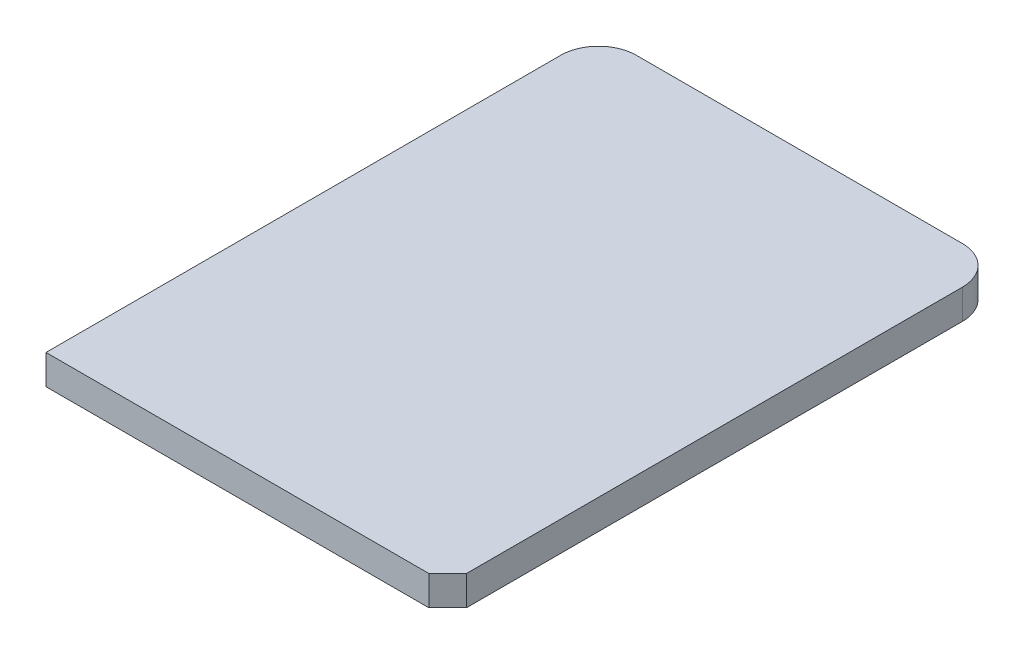
ISO-10303-21;
HEADER;
FILE_DESCRIPTION(('STEP AP214'),'2;1');
FILE_NAME('part.step','',(''),(''),'','','');
FILE_SCHEMA(('AUTOMOTIVE_DESIGN { 1 0 10303 214 1 1 1 1 }'));
ENDSEC;
DATA;
#1=APPLICATION_CONTEXT('core data for automotive mechanical design processes');
#2=APPLICATION_PROTOCOL_DEFINITION('international standard','automotive_design',2000,#1);
#3=PRODUCT_CONTEXT('',#1,'mechanical');
#4=PRODUCT('Part','Part','',(#3));
#5=PRODUCT_RELATED_PRODUCT_CATEGORY('part','',(#4));
#6=PRODUCT_DEFINITION_FORMATION('','',#4);
#7=PRODUCT_DEFINITION_CONTEXT('part definition',#1,'design');
#8=PRODUCT_DEFINITION('design','',#6,#7);
#9=PRODUCT_DEFINITION_SHAPE('','',#8);
#10=(LENGTH_UNIT() NAMED_UNIT(*) SI_UNIT(.MILLI.,.METRE.));
#11=(NAMED_UNIT(*) PLANE_ANGLE_UNIT() SI_UNIT($,.RADIAN.));
#12=(NAMED_UNIT(*) SI_UNIT($,.STERADIAN.) SOLID_ANGLE_UNIT());
#13=UNCERTAINTY_MEASURE_WITH_UNIT(LENGTH_MEASURE(1.E-05),#10,'distance_accuracy_value','');
#14=(GEOMETRIC_REPRESENTATION_CONTEXT(3) GLOBAL_UNCERTAINTY_ASSIGNED_CONTEXT((#13)) GLOBAL_UNIT_ASSIGNED_CONTEXT((#10,
#11,#12)) REPRESENTATION_CONTEXT('',''));
#15=CARTESIAN_POINT('',(0.,0.,0.));
#16=DIRECTION('',(0.,0.,1.));
#17=DIRECTION('',(1.,0.,0.));
#18=AXIS2_PLACEMENT_3D('',#15,#16,#17);
#19=CARTESIAN_POINT('',(20.3,1.575,0.));
#20=DIRECTION('',(-0.707106781186547,0.,-0.707106781186548));
#21=DIRECTION('',(-0.707106781186548,0.,0.707106781186547));
#22=AXIS2_PLACEMENT_3D('',#19,#20,#21);
#23=PLANE('',#22);
#24=DIRECTION('',(0.707106781186548,0.,-0.707106781186547));
#25=VECTOR('',#24,1.);
#26=CARTESIAN_POINT('',(20.3,0.,0.));
#27=LINE('',#26,#25);
#28=CARTESIAN_POINT('',(20.3,0.,0.));
#29=VERTEX_POINT('',#28);
#30=CARTESIAN_POINT('',(21.3,0.,-1.));
#31=VERTEX_POINT('',#30);
#32=EDGE_CURVE('E128',#29,#31,#27,.T.);
#33=ORIENTED_EDGE('',*,*,#32,.T.);
#34=DIRECTION('',(0.,-1.,0.));
#35=VECTOR('',#34,1.);
#36=CARTESIAN_POINT('',(21.3,1.575,-1.));
#37=LINE('',#36,#35);
#38=CARTESIAN_POINT('',(21.3,1.575,-1.));
#39=VERTEX_POINT('',#38);
#40=EDGE_CURVE('E11',#39,#31,#37,.T.);
#41=ORIENTED_EDGE('',*,*,#40,.F.);
#42=DIRECTION('',(0.707106781186548,0.,-0.707106781186547));
#43=VECTOR('',#42,1.);
#44=CARTESIAN_POINT('',(20.3,1.575,0.));
#45=LINE('',#44,#43);
#46=CARTESIAN_POINT('',(20.3,1.575,0.));
#47=VERTEX_POINT('',#46);
#48=EDGE_CURVE('E141',#47,#39,#45,.T.);
#49=ORIENTED_EDGE('',*,*,#48,.F.);
#50=DIRECTION('',(0.,-1.,0.));
#51=VECTOR('',#50,1.);
#52=CARTESIAN_POINT('',(20.3,1.575,0.));
#53=LINE('',#52,#51);
#54=EDGE_CURVE('E124',#47,#29,#53,.T.);
#55=ORIENTED_EDGE('',*,*,#54,.T.);
#56=EDGE_LOOP('',(#33,#41,#49,#55));
#57=FACE_BOUND('',#56,.T.);
#58=ADVANCED_FACE('F37',(#57),#23,.F.);
#59=CARTESIAN_POINT('',(21.3,1.575,-1.));
#60=DIRECTION('',(-1.,0.,0.));
#61=DIRECTION('',(0.,0.,1.));
#62=AXIS2_PLACEMENT_3D('',#59,#60,#61);
#63=PLANE('',#62);
#64=DIRECTION('',(0.,0.,-1.));
#65=VECTOR('',#64,1.);
#66=CARTESIAN_POINT('',(21.3,0.,-1.));
#67=LINE('',#66,#65);
#68=CARTESIAN_POINT('',(21.3,0.,-27.3));
#69=VERTEX_POINT('',#68);
#70=EDGE_CURVE('E131',#31,#69,#67,.T.);
#71=ORIENTED_EDGE('',*,*,#70,.T.);
#72=DIRECTION('',(0.,-1.,0.));
#73=VECTOR('',#72,1.);
#74=CARTESIAN_POINT('',(21.3,1.575,-27.3));
#75=LINE('',#74,#73);
#76=CARTESIAN_POINT('',(21.3,1.575,-27.3));
#77=VERTEX_POINT('',#76);
#78=EDGE_CURVE('E45',#77,#69,#75,.T.);
#79=ORIENTED_EDGE('',*,*,#78,.F.);
#80=DIRECTION('',(0.,0.,-1.));
#81=VECTOR('',#80,1.);
#82=CARTESIAN_POINT('',(21.3,1.575,-1.));
#83=LINE('',#82,#81);
#84=EDGE_CURVE('E90',#39,#77,#83,.T.);
#85=ORIENTED_EDGE('',*,*,#84,.F.);
#86=ORIENTED_EDGE('',*,*,#40,.T.);
#87=EDGE_LOOP('',(#71,#79,#85,#86));
#88=FACE_BOUND('',#87,.T.);
#89=ADVANCED_FACE('F164',(#88),#63,.F.);
#90=CARTESIAN_POINT('',(19.3,1.575,-27.3));
#91=DIRECTION('',(0.,-1.,0.));
#92=DIRECTION('',(0.,0.,-1.));
#93=AXIS2_PLACEMENT_3D('',#90,#91,#92);
#94=CYLINDRICAL_SURFACE('',#93,2.);
#95=CARTESIAN_POINT('',(19.3,0.,-27.3));
#96=DIRECTION('',(0.,1.,0.));
#97=DIRECTION('',(0.,0.,-1.));
#98=AXIS2_PLACEMENT_3D('',#95,#96,#97);
#99=CIRCLE('',#98,2.);
#100=CARTESIAN_POINT('',(19.3,0.,-29.3));
#101=VERTEX_POINT('',#100);
#102=EDGE_CURVE('E133',#69,#101,#99,.T.);
#103=ORIENTED_EDGE('',*,*,#102,.T.);
#104=DIRECTION('',(0.,-1.,0.));
#105=VECTOR('',#104,1.);
#106=CARTESIAN_POINT('',(19.3,1.575,-29.3));
#107=LINE('',#106,#105);
#108=CARTESIAN_POINT('',(19.3,1.575,-29.3));
#109=VERTEX_POINT('',#108);
#110=EDGE_CURVE('E145',#109,#101,#107,.T.);
#111=ORIENTED_EDGE('',*,*,#110,.F.);
#112=CARTESIAN_POINT('',(19.3,1.575,-27.3));
#113=DIRECTION('',(0.,1.,0.));
#114=DIRECTION('',(0.,0.,-1.));
#115=AXIS2_PLACEMENT_3D('',#112,#113,#114);
#116=CIRCLE('',#115,2.);
#117=EDGE_CURVE('E153',#77,#109,#116,.T.);
#118=ORIENTED_EDGE('',*,*,#117,.F.);
#119=ORIENTED_EDGE('',*,*,#78,.T.);
#120=EDGE_LOOP('',(#103,#111,#118,#119));
#121=FACE_BOUND('',#120,.T.);
#122=ADVANCED_FACE('F151',(#121),#94,.T.);
#123=CARTESIAN_POINT('',(2.,1.575,-29.3));
#124=DIRECTION('',(0.,0.,1.));
#125=DIRECTION('',(1.,0.,0.));
#126=AXIS2_PLACEMENT_3D('',#123,#124,#125);
#127=PLANE('',#126);
#128=DIRECTION('',(-1.,0.,0.));
#129=VECTOR('',#128,1.);
#130=CARTESIAN_POINT('',(2.,0.,-29.3));
#131=LINE('',#130,#129);
#132=CARTESIAN_POINT('',(2.,0.,-29.3));
#133=VERTEX_POINT('',#132);
#134=EDGE_CURVE('E135',#101,#133,#131,.T.);
#135=ORIENTED_EDGE('',*,*,#134,.T.);
#136=DIRECTION('',(0.,-1.,0.));
#137=VECTOR('',#136,1.);
#138=CARTESIAN_POINT('',(2.,1.575,-29.3));
#139=LINE('',#138,#137);
#140=CARTESIAN_POINT('',(2.,1.575,-29.3));
#141=VERTEX_POINT('',#140);
#142=EDGE_CURVE('E119',#141,#133,#139,.T.);
#143=ORIENTED_EDGE('',*,*,#142,.F.);
#144=DIRECTION('',(-1.,0.,0.));
#145=VECTOR('',#144,1.);
#146=CARTESIAN_POINT('',(2.,1.575,-29.3));
#147=LINE('',#146,#145);
#148=EDGE_CURVE('E107',#109,#141,#147,.T.);
#149=ORIENTED_EDGE('',*,*,#148,.F.);
#150=ORIENTED_EDGE('',*,*,#110,.T.);
#151=EDGE_LOOP('',(#135,#143,#149,#150));
#152=FACE_BOUND('',#151,.T.);
#153=ADVANCED_FACE('F157',(#152),#127,.F.);
#154=CARTESIAN_POINT('',(2.,1.575,-27.3));
#155=DIRECTION('',(0.,-1.,0.));
#156=DIRECTION('',(0.,0.,-1.));
#157=AXIS2_PLACEMENT_3D('',#154,#155,#156);
#158=CYLINDRICAL_SURFACE('',#157,2.);
#159=CARTESIAN_POINT('',(2.,0.,-27.3));
#160=DIRECTION('',(0.,1.,0.));
#161=DIRECTION('',(0.,0.,-1.));
#162=AXIS2_PLACEMENT_3D('',#159,#160,#161);
#163=CIRCLE('',#162,2.);
#164=CARTESIAN_POINT('',(0.,0.,-27.3));
#165=VERTEX_POINT('',#164);
#166=EDGE_CURVE('E117',#133,#165,#163,.T.);
#167=ORIENTED_EDGE('',*,*,#166,.T.);
#168=DIRECTION('',(0.,-1.,0.));
#169=VECTOR('',#168,1.);
#170=CARTESIAN_POINT('',(0.,1.575,-27.3));
#171=LINE('',#170,#169);
#172=CARTESIAN_POINT('',(0.,1.575,-27.3));
#173=VERTEX_POINT('',#172);
#174=EDGE_CURVE('E114',#173,#165,#171,.T.);
#175=ORIENTED_EDGE('',*,*,#174,.F.);
#176=CARTESIAN_POINT('',(2.,1.575,-27.3));
#177=DIRECTION('',(0.,1.,0.));
#178=DIRECTION('',(0.,0.,-1.));
#179=AXIS2_PLACEMENT_3D('',#176,#177,#178);
#180=CIRCLE('',#179,2.);
#181=EDGE_CURVE('E100',#141,#173,#180,.T.);
#182=ORIENTED_EDGE('',*,*,#181,.F.);
#183=ORIENTED_EDGE('',*,*,#142,.T.);
#184=EDGE_LOOP('',(#167,#175,#182,#183));
#185=FACE_BOUND('',#184,.T.);
#186=ADVANCED_FACE('F115',(#185),#158,.T.);
#187=CARTESIAN_POINT('',(0.,1.575,-2.00000000000001));
#188=DIRECTION('',(1.,0.,0.));
#189=DIRECTION('',(0.,0.,-1.));
#190=AXIS2_PLACEMENT_3D('',#187,#188,#189);
#191=PLANE('',#190);
#192=DIRECTION('',(0.,0.,1.));
#193=VECTOR('',#192,1.);
#194=CARTESIAN_POINT('',(0.,0.,-2.00000000000001));
#195=LINE('',#194,#193);
#196=CARTESIAN_POINT('',(0.,0.,0.));
#197=VERTEX_POINT('',#196);
#198=EDGE_CURVE('E138',#165,#197,#195,.T.);
#199=ORIENTED_EDGE('',*,*,#198,.T.);
#200=DIRECTION('',(0.,-1.,0.));
#201=VECTOR('',#200,1.);
#202=CARTESIAN_POINT('',(0.,1.575,0.));
#203=LINE('',#202,#201);
#204=CARTESIAN_POINT('',(0.,1.575,0.));
#205=VERTEX_POINT('',#204);
#206=EDGE_CURVE('E120',#205,#197,#203,.T.);
#207=ORIENTED_EDGE('',*,*,#206,.F.);
#208=DIRECTION('',(0.,0.,1.));
#209=VECTOR('',#208,1.);
#210=CARTESIAN_POINT('',(0.,1.575,-2.00000000000001));
#211=LINE('',#210,#209);
#212=EDGE_CURVE('E104',#173,#205,#211,.T.);
#213=ORIENTED_EDGE('',*,*,#212,.F.);
#214=ORIENTED_EDGE('',*,*,#174,.T.);
#215=EDGE_LOOP('',(#199,#207,#213,#214));
#216=FACE_BOUND('',#215,.T.);
#217=ADVANCED_FACE('F122',(#216),#191,.F.);
#218=CARTESIAN_POINT('',(2.00000000000001,1.575,0.));
#219=DIRECTION('',(0.,0.,-1.));
#220=DIRECTION('',(-1.,0.,0.));
#221=AXIS2_PLACEMENT_3D('',#218,#219,#220);
#222=PLANE('',#221);
#223=DIRECTION('',(1.,0.,0.));
#224=VECTOR('',#223,1.);
#225=CARTESIAN_POINT('',(2.00000000000001,0.,0.));
#226=LINE('',#225,#224);
#227=EDGE_CURVE('E78',#197,#29,#226,.T.);
#228=ORIENTED_EDGE('',*,*,#227,.T.);
#229=ORIENTED_EDGE('',*,*,#54,.F.);
#230=DIRECTION('',(1.,0.,0.));
#231=VECTOR('',#230,1.);
#232=CARTESIAN_POINT('',(0.,1.575,0.));
#233=LINE('',#232,#231);
#234=EDGE_CURVE('E53',#205,#47,#233,.T.);
#235=ORIENTED_EDGE('',*,*,#234,.F.);
#236=ORIENTED_EDGE('',*,*,#206,.T.);
#237=EDGE_LOOP('',(#228,#229,#235,#236));
#238=FACE_BOUND('',#237,.T.);
#239=ADVANCED_FACE('F178',(#238),#222,.F.);
#240=CARTESIAN_POINT('',(19.3,1.575,-27.3));
#241=DIRECTION('',(0.,-1.,0.));
#242=DIRECTION('',(0.,0.,-1.));
#243=AXIS2_PLACEMENT_3D('',#240,#241,#242);
#244=PLANE('',#243);
#245=ORIENTED_EDGE('',*,*,#48,.T.);
#246=ORIENTED_EDGE('',*,*,#84,.T.);
#247=ORIENTED_EDGE('',*,*,#117,.T.);
#248=ORIENTED_EDGE('',*,*,#148,.T.);
#249=ORIENTED_EDGE('',*,*,#181,.T.);
#250=ORIENTED_EDGE('',*,*,#212,.T.);
#251=ORIENTED_EDGE('',*,*,#234,.T.);
#252=EDGE_LOOP('',(#245,#246,#247,#248,#249,#250,#251));
#253=FACE_BOUND('',#252,.T.);
#254=ADVANCED_FACE('F102',(#253),#244,.F.);
#255=CARTESIAN_POINT('',(19.3,0.,-27.3));
#256=DIRECTION('',(0.,-1.,0.));
#257=DIRECTION('',(0.,0.,-1.));
#258=AXIS2_PLACEMENT_3D('',#255,#256,#257);
#259=PLANE('',#258);
#260=ORIENTED_EDGE('',*,*,#32,.F.);
#261=ORIENTED_EDGE('',*,*,#227,.F.);
#262=ORIENTED_EDGE('',*,*,#198,.F.);
#263=ORIENTED_EDGE('',*,*,#166,.F.);
#264=ORIENTED_EDGE('',*,*,#134,.F.);
#265=ORIENTED_EDGE('',*,*,#102,.F.);
#266=ORIENTED_EDGE('',*,*,#70,.F.);
#267=EDGE_LOOP('',(#260,#261,#262,#263,#264,#265,#266));
#268=FACE_BOUND('',#267,.T.);
#269=ADVANCED_FACE('F155',(#268),#259,.T.);
#270=CLOSED_SHELL('',(#58,#89,#122,#153,#186,#217,#239,#254,#269));
#271=MANIFOLD_SOLID_BREP('B2',#270);
#272=ADVANCED_BREP_SHAPE_REPRESENTATION('',(#18,#271),#14);
#273=SHAPE_DEFINITION_REPRESENTATION(#9,#272);
ENDSEC;
END-ISO-10303-21;
